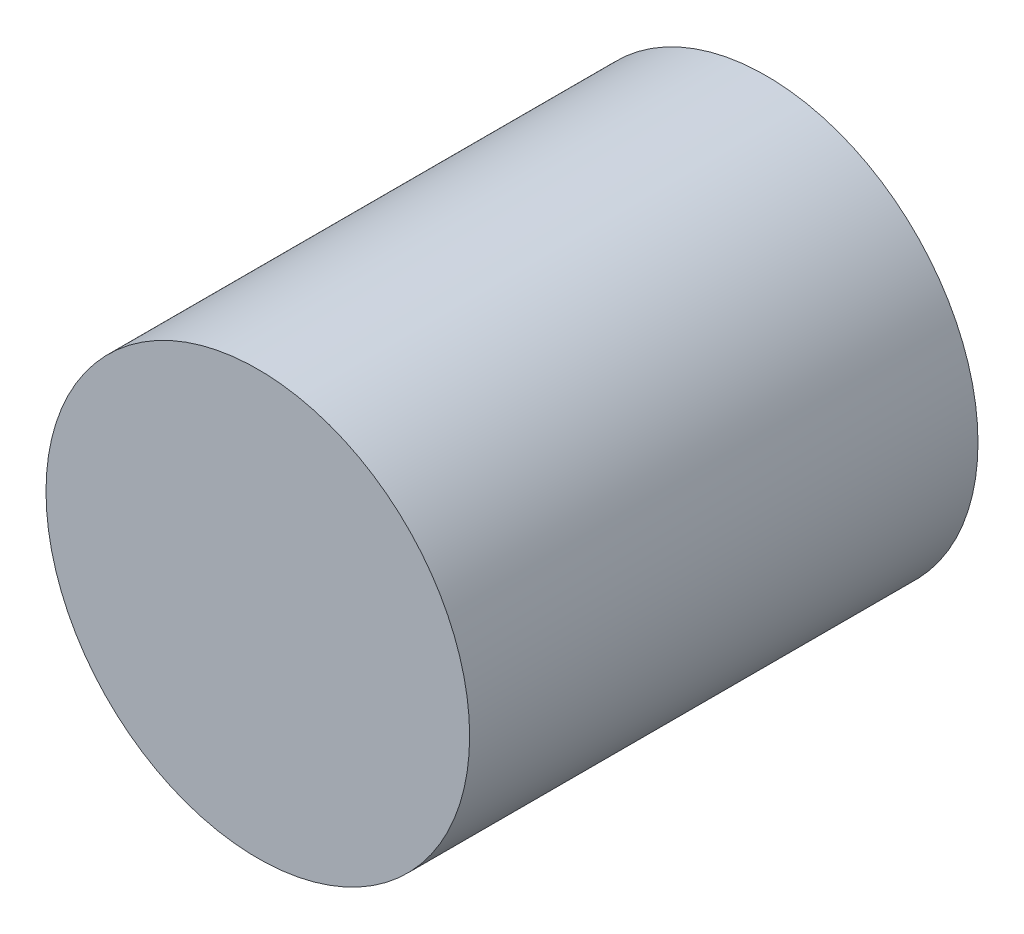
ISO-10303-21;
HEADER;
FILE_DESCRIPTION(('STEP AP214'),'2;1');
FILE_NAME('part.step','',(''),(''),'','','');
FILE_SCHEMA(('AUTOMOTIVE_DESIGN { 1 0 10303 214 1 1 1 1 }'));
ENDSEC;
DATA;
#1=APPLICATION_CONTEXT('core data for automotive mechanical design processes');
#2=APPLICATION_PROTOCOL_DEFINITION('international standard','automotive_design',2000,#1);
#3=PRODUCT_CONTEXT('',#1,'mechanical');
#4=PRODUCT('Part','Part','',(#3));
#5=PRODUCT_RELATED_PRODUCT_CATEGORY('part','',(#4));
#6=PRODUCT_DEFINITION_FORMATION('','',#4);
#7=PRODUCT_DEFINITION_CONTEXT('part definition',#1,'design');
#8=PRODUCT_DEFINITION('design','',#6,#7);
#9=PRODUCT_DEFINITION_SHAPE('','',#8);
#10=(LENGTH_UNIT() NAMED_UNIT(*) SI_UNIT(.MILLI.,.METRE.));
#11=(NAMED_UNIT(*) PLANE_ANGLE_UNIT() SI_UNIT($,.RADIAN.));
#12=(NAMED_UNIT(*) SI_UNIT($,.STERADIAN.) SOLID_ANGLE_UNIT());
#13=UNCERTAINTY_MEASURE_WITH_UNIT(LENGTH_MEASURE(1.E-05),#10,'distance_accuracy_value','');
#14=(GEOMETRIC_REPRESENTATION_CONTEXT(3) GLOBAL_UNCERTAINTY_ASSIGNED_CONTEXT((#13)) GLOBAL_UNIT_ASSIGNED_CONTEXT((#10,
#11,#12)) REPRESENTATION_CONTEXT('',''));
#15=CARTESIAN_POINT('',(0.,0.,0.));
#16=DIRECTION('',(0.,0.,1.));
#17=DIRECTION('',(1.,0.,0.));
#18=AXIS2_PLACEMENT_3D('',#15,#16,#17);
#19=CARTESIAN_POINT('',(0.,0.,76.2));
#20=DIRECTION('',(0.,0.,-1.));
#21=DIRECTION('',(-1.,0.,0.));
#22=AXIS2_PLACEMENT_3D('',#19,#20,#21);
#23=CYLINDRICAL_SURFACE('',#22,31.75);
#24=CARTESIAN_POINT('',(0.,0.,76.2));
#25=DIRECTION('',(0.,0.,1.));
#26=DIRECTION('',(1.,0.,0.));
#27=AXIS2_PLACEMENT_3D('',#24,#25,#26);
#28=CIRCLE('',#27,31.75);
#29=CARTESIAN_POINT('',(-31.75,0.,76.2));
#30=VERTEX_POINT('',#29);
#31=EDGE_CURVE('E10',#30,#30,#28,.T.);
#32=CARTESIAN_POINT('',(0.,0.,0.));
#33=DIRECTION('',(0.,0.,1.));
#34=DIRECTION('',(1.,0.,0.));
#35=AXIS2_PLACEMENT_3D('',#32,#33,#34);
#36=CIRCLE('',#35,31.75);
#37=CARTESIAN_POINT('',(-31.75,0.,0.));
#38=VERTEX_POINT('',#37);
#39=EDGE_CURVE('E34',#38,#38,#36,.T.);
#40=CARTESIAN_POINT('',(-31.75,0.,76.2));
#41=CARTESIAN_POINT('',(-31.75,0.,75.40625));
#42=CARTESIAN_POINT('',(-31.75,0.,74.6125));
#43=CARTESIAN_POINT('',(-31.75,0.,73.025));
#44=CARTESIAN_POINT('',(-31.75,0.,72.23125));
#45=CARTESIAN_POINT('',(-31.75,0.,70.64375));
#46=CARTESIAN_POINT('',(-31.75,0.,69.85));
#47=CARTESIAN_POINT('',(-31.75,0.,68.2625));
#48=CARTESIAN_POINT('',(-31.75,0.,67.46875));
#49=CARTESIAN_POINT('',(-31.75,0.,65.88125));
#50=CARTESIAN_POINT('',(-31.75,0.,65.0875));
#51=CARTESIAN_POINT('',(-31.75,0.,63.5));
#52=CARTESIAN_POINT('',(-31.75,0.,62.70625));
#53=CARTESIAN_POINT('',(-31.75,0.,61.11875));
#54=CARTESIAN_POINT('',(-31.75,0.,60.325));
#55=CARTESIAN_POINT('',(-31.75,0.,58.7375));
#56=CARTESIAN_POINT('',(-31.75,0.,57.94375));
#57=CARTESIAN_POINT('',(-31.75,0.,56.35625));
#58=CARTESIAN_POINT('',(-31.75,0.,55.5625));
#59=CARTESIAN_POINT('',(-31.75,0.,53.975));
#60=CARTESIAN_POINT('',(-31.75,0.,53.18125));
#61=CARTESIAN_POINT('',(-31.75,0.,51.59375));
#62=CARTESIAN_POINT('',(-31.75,0.,50.8));
#63=CARTESIAN_POINT('',(-31.75,0.,49.2125));
#64=CARTESIAN_POINT('',(-31.75,0.,48.41875));
#65=CARTESIAN_POINT('',(-31.75,0.,46.83125));
#66=CARTESIAN_POINT('',(-31.75,0.,46.0375));
#67=CARTESIAN_POINT('',(-31.75,0.,44.45));
#68=CARTESIAN_POINT('',(-31.75,0.,43.65625));
#69=CARTESIAN_POINT('',(-31.75,0.,42.06875));
#70=CARTESIAN_POINT('',(-31.75,0.,41.275));
#71=CARTESIAN_POINT('',(-31.75,0.,39.6875));
#72=CARTESIAN_POINT('',(-31.75,0.,38.89375));
#73=CARTESIAN_POINT('',(-31.75,0.,37.30625));
#74=CARTESIAN_POINT('',(-31.75,0.,36.5125));
#75=CARTESIAN_POINT('',(-31.75,0.,34.925));
#76=CARTESIAN_POINT('',(-31.75,0.,34.13125));
#77=CARTESIAN_POINT('',(-31.75,0.,32.54375));
#78=CARTESIAN_POINT('',(-31.75,0.,31.75));
#79=CARTESIAN_POINT('',(-31.75,0.,30.1625));
#80=CARTESIAN_POINT('',(-31.75,0.,29.36875));
#81=CARTESIAN_POINT('',(-31.75,0.,27.78125));
#82=CARTESIAN_POINT('',(-31.75,0.,26.9875));
#83=CARTESIAN_POINT('',(-31.75,0.,25.4));
#84=CARTESIAN_POINT('',(-31.75,0.,24.60625));
#85=CARTESIAN_POINT('',(-31.75,0.,23.01875));
#86=CARTESIAN_POINT('',(-31.75,0.,22.225));
#87=CARTESIAN_POINT('',(-31.75,0.,20.6375));
#88=CARTESIAN_POINT('',(-31.75,0.,19.84375));
#89=CARTESIAN_POINT('',(-31.75,0.,18.25625));
#90=CARTESIAN_POINT('',(-31.75,0.,17.4625));
#91=CARTESIAN_POINT('',(-31.75,0.,15.875));
#92=CARTESIAN_POINT('',(-31.75,0.,15.08125));
#93=CARTESIAN_POINT('',(-31.75,0.,13.49375));
#94=CARTESIAN_POINT('',(-31.75,0.,12.7));
#95=CARTESIAN_POINT('',(-31.75,0.,11.1125));
#96=CARTESIAN_POINT('',(-31.75,0.,10.31875));
#97=CARTESIAN_POINT('',(-31.75,0.,8.73125));
#98=CARTESIAN_POINT('',(-31.75,0.,7.93750000000001));
#99=CARTESIAN_POINT('',(-31.75,0.,6.35));
#100=CARTESIAN_POINT('',(-31.75,0.,5.55625));
#101=CARTESIAN_POINT('',(-31.75,0.,3.96875));
#102=CARTESIAN_POINT('',(-31.75,0.,3.175));
#103=CARTESIAN_POINT('',(-31.75,0.,1.5875));
#104=CARTESIAN_POINT('',(-31.75,0.,0.793750000000001));
#105=CARTESIAN_POINT('',(-31.75,0.,0.));
#106=B_SPLINE_CURVE_WITH_KNOTS('',3,(#40,#41,#42,#43,#44,#45,#46,#47,#48,#49,#50,#51,#52,#53,
#54,#55,#56,#57,#58,#59,#60,#61,#62,#63,#64,#65,#66,#67,#68,#69,#70,#71,#72,#73,#74,#75,#76,#77,
#78,#79,#80,#81,#82,#83,#84,#85,#86,#87,#88,#89,#90,#91,#92,#93,#94,#95,#96,#97,#98,#99,#100,
#101,#102,#103,#104,#105),.UNSPECIFIED.,.F.,.F.,(4,2,2,2,2,2,2,2,2,2,2,2,2,2,2,2,2,2,2,2,2,2,2,
2,2,2,2,2,2,2,2,2,4),(0.,2.38124999999999,4.76249999999999,7.14374999999999,9.52499999999999,
11.90625,14.2875,16.66875,19.05,21.43125,23.8125,26.19375,28.575,30.95625,33.3375,35.71875,38.1,
40.48125,42.8625,45.24375,47.625,50.00625,52.3875,54.76875,57.15,59.53125,61.9125,64.29375,
66.675,69.05625,71.4375,73.81875,76.2),.UNSPECIFIED.);
#107=EDGE_CURVE('BSEAM31',#30,#38,#106,.T.);
#108=ORIENTED_EDGE('',*,*,#31,.F.);
#109=ORIENTED_EDGE('',*,*,#39,.T.);
#110=ORIENTED_EDGE('',*,*,#107,.T.);
#111=ORIENTED_EDGE('',*,*,#107,.F.);
#112=EDGE_LOOP('',(#108,#110,#109,#111));
#113=FACE_BOUND('',#112,.T.);
#114=ADVANCED_FACE('F31',(#113),#23,.T.);
#115=CARTESIAN_POINT('',(0.,0.,76.2));
#116=DIRECTION('',(0.,0.,1.));
#117=DIRECTION('',(1.,0.,0.));
#118=AXIS2_PLACEMENT_3D('',#115,#116,#117);
#119=PLANE('',#118);
#120=ORIENTED_EDGE('',*,*,#31,.T.);
#121=EDGE_LOOP('',(#120));
#122=FACE_BOUND('',#121,.T.);
#123=ADVANCED_FACE('F46',(#122),#119,.T.);
#124=CARTESIAN_POINT('',(0.,0.,0.));
#125=DIRECTION('',(0.,0.,1.));
#126=DIRECTION('',(1.,0.,0.));
#127=AXIS2_PLACEMENT_3D('',#124,#125,#126);
#128=PLANE('',#127);
#129=ORIENTED_EDGE('',*,*,#39,.F.);
#130=EDGE_LOOP('',(#129));
#131=FACE_BOUND('',#130,.T.);
#132=ADVANCED_FACE('F44',(#131),#128,.F.);
#133=CLOSED_SHELL('',(#114,#123,#132));
#134=MANIFOLD_SOLID_BREP('B2',#133);
#135=ADVANCED_BREP_SHAPE_REPRESENTATION('',(#18,#134),#14);
#136=SHAPE_DEFINITION_REPRESENTATION(#9,#135);
ENDSEC;
END-ISO-10303-21;
